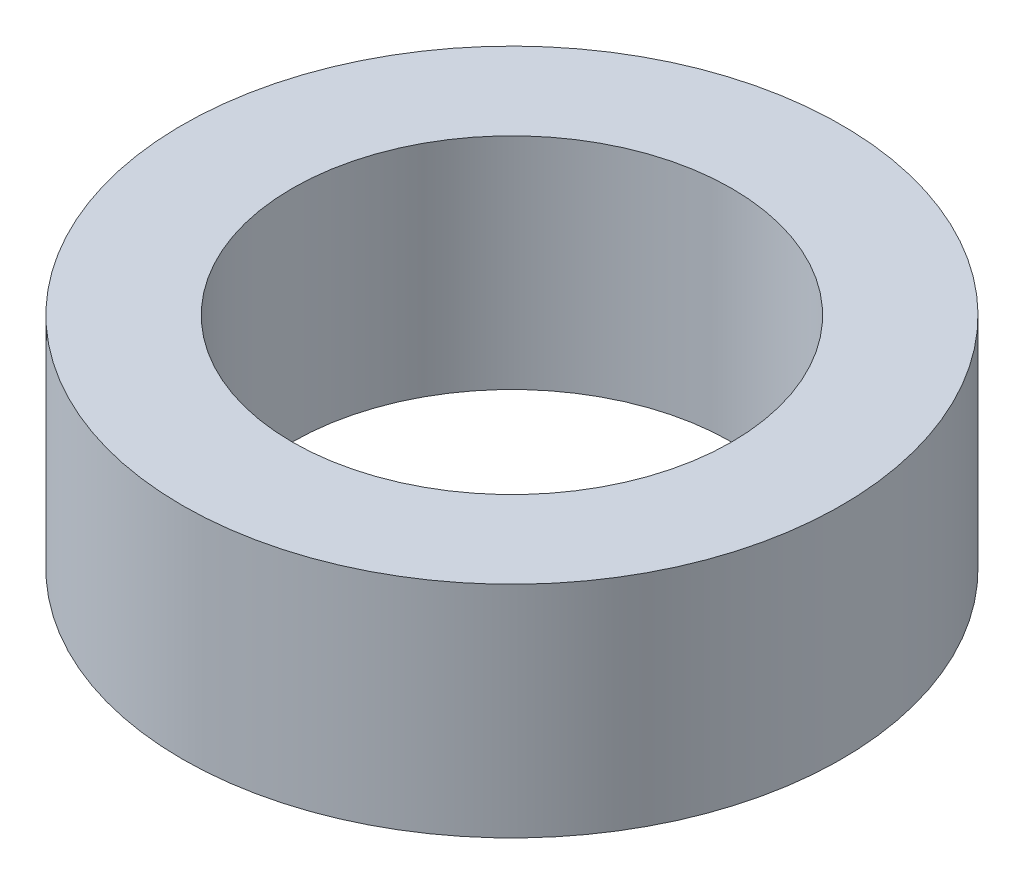
ISO-10303-21;
HEADER;
FILE_DESCRIPTION(('STEP AP214'),'2;1');
FILE_NAME('part.step','',(''),(''),'','','');
FILE_SCHEMA(('AUTOMOTIVE_DESIGN { 1 0 10303 214 1 1 1 1 }'));
ENDSEC;
DATA;
#1=APPLICATION_CONTEXT('core data for automotive mechanical design processes');
#2=APPLICATION_PROTOCOL_DEFINITION('international standard','automotive_design',2000,#1);
#3=PRODUCT_CONTEXT('',#1,'mechanical');
#4=PRODUCT('Part','Part','',(#3));
#5=PRODUCT_RELATED_PRODUCT_CATEGORY('part','',(#4));
#6=PRODUCT_DEFINITION_FORMATION('','',#4);
#7=PRODUCT_DEFINITION_CONTEXT('part definition',#1,'design');
#8=PRODUCT_DEFINITION('design','',#6,#7);
#9=PRODUCT_DEFINITION_SHAPE('','',#8);
#10=(LENGTH_UNIT() NAMED_UNIT(*) SI_UNIT(.MILLI.,.METRE.));
#11=(NAMED_UNIT(*) PLANE_ANGLE_UNIT() SI_UNIT($,.RADIAN.));
#12=(NAMED_UNIT(*) SI_UNIT($,.STERADIAN.) SOLID_ANGLE_UNIT());
#13=UNCERTAINTY_MEASURE_WITH_UNIT(LENGTH_MEASURE(1.E-05),#10,'distance_accuracy_value','');
#14=(GEOMETRIC_REPRESENTATION_CONTEXT(3) GLOBAL_UNCERTAINTY_ASSIGNED_CONTEXT((#13)) GLOBAL_UNIT_ASSIGNED_CONTEXT((#10,
#11,#12)) REPRESENTATION_CONTEXT('',''));
#15=CARTESIAN_POINT('',(0.,0.,0.));
#16=DIRECTION('',(0.,0.,1.));
#17=DIRECTION('',(1.,0.,0.));
#18=AXIS2_PLACEMENT_3D('',#15,#16,#17);
#19=CARTESIAN_POINT('',(0.,5.,0.));
#20=DIRECTION('',(0.,1.,0.));
#21=DIRECTION('',(0.,0.,1.));
#22=AXIS2_PLACEMENT_3D('',#19,#20,#21);
#23=PLANE('',#22);
#24=CARTESIAN_POINT('',(0.,5.,0.));
#25=DIRECTION('',(0.,1.,0.));
#26=DIRECTION('',(0.,0.,1.));
#27=AXIS2_PLACEMENT_3D('',#24,#25,#26);
#28=CIRCLE('',#27,7.5);
#29=CARTESIAN_POINT('',(0.,5.,7.5));
#30=VERTEX_POINT('',#29);
#31=EDGE_CURVE('E10',#30,#30,#28,.T.);
#32=ORIENTED_EDGE('',*,*,#31,.T.);
#33=EDGE_LOOP('',(#32));
#34=FACE_BOUND('',#33,.T.);
#35=CARTESIAN_POINT('',(0.,5.,0.));
#36=DIRECTION('',(0.,1.,0.));
#37=DIRECTION('',(0.,0.,1.));
#38=AXIS2_PLACEMENT_3D('',#35,#36,#37);
#39=CIRCLE('',#38,5.);
#40=CARTESIAN_POINT('',(0.,5.,5.));
#41=VERTEX_POINT('',#40);
#42=EDGE_CURVE('E50',#41,#41,#39,.T.);
#43=ORIENTED_EDGE('',*,*,#42,.F.);
#44=EDGE_LOOP('',(#43));
#45=FACE_BOUND('',#44,.T.);
#46=ADVANCED_FACE('F37',(#34,#45),#23,.T.);
#47=CARTESIAN_POINT('',(0.,0.,0.));
#48=DIRECTION('',(0.,1.,0.));
#49=DIRECTION('',(0.,0.,1.));
#50=AXIS2_PLACEMENT_3D('',#47,#48,#49);
#51=PLANE('',#50);
#52=CARTESIAN_POINT('',(0.,0.,0.));
#53=DIRECTION('',(0.,1.,0.));
#54=DIRECTION('',(0.,0.,1.));
#55=AXIS2_PLACEMENT_3D('',#52,#53,#54);
#56=CIRCLE('',#55,7.5);
#57=CARTESIAN_POINT('',(0.,0.,7.5));
#58=VERTEX_POINT('',#57);
#59=EDGE_CURVE('E41',#58,#58,#56,.T.);
#60=ORIENTED_EDGE('',*,*,#59,.F.);
#61=EDGE_LOOP('',(#60));
#62=FACE_BOUND('',#61,.T.);
#63=CARTESIAN_POINT('',(0.,0.,0.));
#64=DIRECTION('',(0.,1.,0.));
#65=DIRECTION('',(0.,0.,1.));
#66=AXIS2_PLACEMENT_3D('',#63,#64,#65);
#67=CIRCLE('',#66,5.);
#68=CARTESIAN_POINT('',(0.,0.,5.));
#69=VERTEX_POINT('',#68);
#70=EDGE_CURVE('E52',#69,#69,#67,.T.);
#71=ORIENTED_EDGE('',*,*,#70,.T.);
#72=EDGE_LOOP('',(#71));
#73=FACE_BOUND('',#72,.T.);
#74=ADVANCED_FACE('F64',(#62,#73),#51,.F.);
#75=CARTESIAN_POINT('',(0.,5.,0.));
#76=DIRECTION('',(0.,-1.,0.));
#77=DIRECTION('',(0.,0.,-1.));
#78=AXIS2_PLACEMENT_3D('',#75,#76,#77);
#79=CYLINDRICAL_SURFACE('',#78,7.5);
#80=ORIENTED_EDGE('',*,*,#31,.F.);
#81=EDGE_LOOP('',(#80));
#82=FACE_BOUND('',#81,.T.);
#83=ORIENTED_EDGE('',*,*,#59,.T.);
#84=EDGE_LOOP('',(#83));
#85=FACE_BOUND('',#84,.T.);
#86=ADVANCED_FACE('F39',(#82,#85),#79,.T.);
#87=CARTESIAN_POINT('',(0.,5.,0.));
#88=DIRECTION('',(0.,-1.,0.));
#89=DIRECTION('',(0.,0.,-1.));
#90=AXIS2_PLACEMENT_3D('',#87,#88,#89);
#91=CYLINDRICAL_SURFACE('',#90,5.);
#92=ORIENTED_EDGE('',*,*,#42,.T.);
#93=EDGE_LOOP('',(#92));
#94=FACE_BOUND('',#93,.T.);
#95=ORIENTED_EDGE('',*,*,#70,.F.);
#96=EDGE_LOOP('',(#95));
#97=FACE_BOUND('',#96,.T.);
#98=ADVANCED_FACE('F60',(#94,#97),#91,.F.);
#99=CLOSED_SHELL('',(#46,#74,#86,#98));
#100=MANIFOLD_SOLID_BREP('B2',#99);
#101=ADVANCED_BREP_SHAPE_REPRESENTATION('',(#18,#100),#14);
#102=SHAPE_DEFINITION_REPRESENTATION(#9,#101);
ENDSEC;
END-ISO-10303-21;
